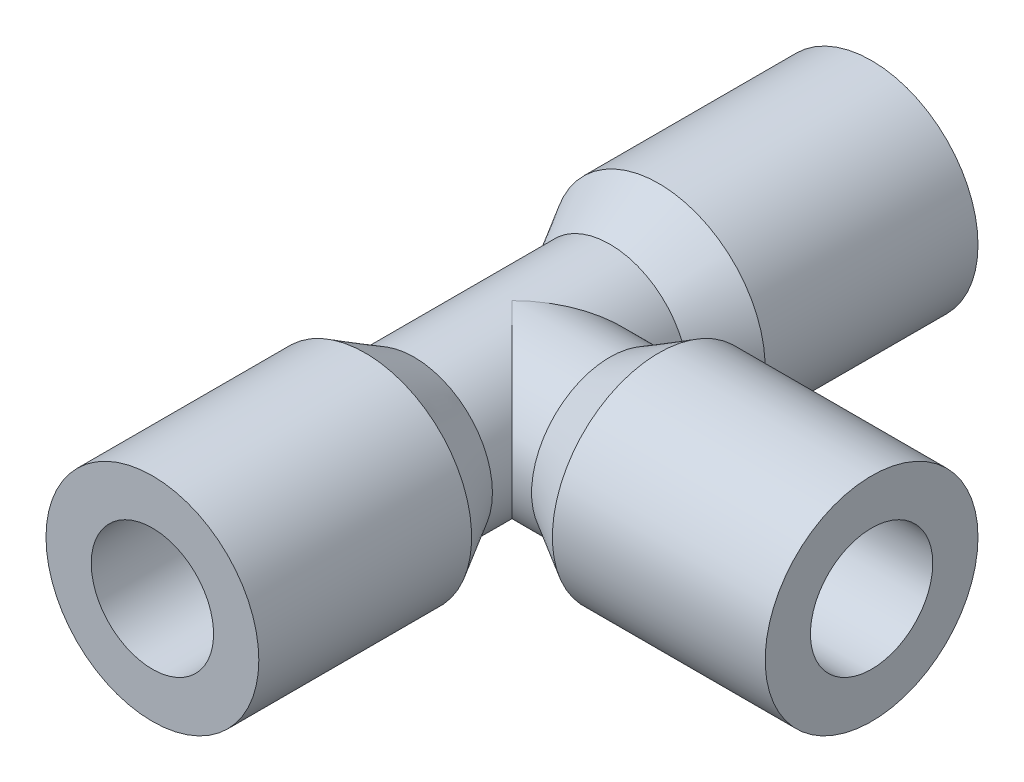
ISO-10303-21;
HEADER;
FILE_DESCRIPTION(('STEP AP214'),'2;1');
FILE_NAME('part.step','',(''),(''),'','','');
FILE_SCHEMA(('AUTOMOTIVE_DESIGN { 1 0 10303 214 1 1 1 1 }'));
ENDSEC;
DATA;
#1=APPLICATION_CONTEXT('core data for automotive mechanical design processes');
#2=APPLICATION_PROTOCOL_DEFINITION('international standard','automotive_design',2000,#1);
#3=PRODUCT_CONTEXT('',#1,'mechanical');
#4=PRODUCT('Part','Part','',(#3));
#5=PRODUCT_RELATED_PRODUCT_CATEGORY('part','',(#4));
#6=PRODUCT_DEFINITION_FORMATION('','',#4);
#7=PRODUCT_DEFINITION_CONTEXT('part definition',#1,'design');
#8=PRODUCT_DEFINITION('design','',#6,#7);
#9=PRODUCT_DEFINITION_SHAPE('','',#8);
#10=(LENGTH_UNIT() NAMED_UNIT(*) SI_UNIT(.MILLI.,.METRE.));
#11=(NAMED_UNIT(*) PLANE_ANGLE_UNIT() SI_UNIT($,.RADIAN.));
#12=(NAMED_UNIT(*) SI_UNIT($,.STERADIAN.) SOLID_ANGLE_UNIT());
#13=UNCERTAINTY_MEASURE_WITH_UNIT(LENGTH_MEASURE(1.E-05),#10,'distance_accuracy_value','');
#14=(GEOMETRIC_REPRESENTATION_CONTEXT(3) GLOBAL_UNCERTAINTY_ASSIGNED_CONTEXT((#13)) GLOBAL_UNIT_ASSIGNED_CONTEXT((#10,
#11,#12)) REPRESENTATION_CONTEXT('',''));
#15=CARTESIAN_POINT('',(0.,0.,0.));
#16=DIRECTION('',(0.,0.,1.));
#17=DIRECTION('',(1.,0.,0.));
#18=AXIS2_PLACEMENT_3D('',#15,#16,#17);
#19=CARTESIAN_POINT('',(1.77799999999999,0.,18.669));
#20=DIRECTION('',(1.,0.,0.));
#21=DIRECTION('',(0.,0.,-1.));
#22=AXIS2_PLACEMENT_3D('',#19,#20,#21);
#23=PLANE('',#22);
#24=DIRECTION('',(0.,0.,-1.));
#25=VECTOR('',#24,1.);
#26=CARTESIAN_POINT('',(1.77799999999999,-2.63046402750542,49.403));
#27=LINE('',#26,#25);
#28=CARTESIAN_POINT('',(1.77799999999999,-2.63046402750542,20.447));
#29=VERTEX_POINT('',#28);
#30=CARTESIAN_POINT('',(1.77799999999999,-2.63046402750542,16.891));
#31=VERTEX_POINT('',#30);
#32=EDGE_CURVE('E12',#29,#31,#27,.T.);
#33=ORIENTED_EDGE('',*,*,#32,.F.);
#34=CARTESIAN_POINT('',(1.77799999999999,0.,18.669));
#35=DIRECTION('',(1.,0.,0.));
#36=DIRECTION('',(0.,0.,-1.));
#37=AXIS2_PLACEMENT_3D('',#34,#35,#36);
#38=CIRCLE('',#37,3.175);
#39=EDGE_CURVE('E86',#29,#31,#38,.T.);
#40=ORIENTED_EDGE('',*,*,#39,.T.);
#41=EDGE_LOOP('',(#33,#40));
#42=FACE_BOUND('',#41,.T.);
#43=ADVANCED_FACE('F40',(#42),#23,.T.);
#44=CARTESIAN_POINT('',(0.,0.,18.669));
#45=DIRECTION('',(0.,0.,-1.));
#46=DIRECTION('',(-1.,0.,0.));
#47=AXIS2_PLACEMENT_3D('',#44,#45,#46);
#48=CYLINDRICAL_SURFACE('',#47,4.064);
#49=CARTESIAN_POINT('',(0.,0.,23.749));
#50=DIRECTION('',(0.,0.,1.));
#51=DIRECTION('',(1.,0.,0.));
#52=AXIS2_PLACEMENT_3D('',#49,#50,#51);
#53=CIRCLE('',#52,4.064);
#54=CARTESIAN_POINT('',(4.064,0.,23.749));
#55=VERTEX_POINT('',#54);
#56=EDGE_CURVE('E150',#55,#55,#53,.T.);
#57=ORIENTED_EDGE('',*,*,#56,.F.);
#58=EDGE_LOOP('',(#57));
#59=FACE_BOUND('',#58,.T.);
#60=CARTESIAN_POINT('',(0.,0.,13.589));
#61=DIRECTION('',(0.,0.,1.));
#62=DIRECTION('',(1.,0.,0.));
#63=AXIS2_PLACEMENT_3D('',#60,#61,#62);
#64=CIRCLE('',#63,4.064);
#65=CARTESIAN_POINT('',(4.064,0.,13.589));
#66=VERTEX_POINT('',#65);
#67=EDGE_CURVE('E159',#66,#66,#64,.T.);
#68=ORIENTED_EDGE('',*,*,#67,.T.);
#69=EDGE_LOOP('',(#68));
#70=FACE_BOUND('',#69,.T.);
#71=CARTESIAN_POINT('',(0.,0.,18.669));
#72=DIRECTION('',(-0.707106781186547,0.,-0.707106781186547));
#73=DIRECTION('',(0.707106781186547,0.,-0.707106781186547));
#74=AXIS2_PLACEMENT_3D('',#71,#72,#73);
#75=ELLIPSE('',#74,5.74736391748426,4.064);
#76=CARTESIAN_POINT('',(0.,-4.064,18.669));
#77=VERTEX_POINT('',#76);
#78=CARTESIAN_POINT('',(0.,4.064,18.669));
#79=VERTEX_POINT('',#78);
#80=EDGE_CURVE('E79',#77,#79,#75,.F.);
#81=ORIENTED_EDGE('',*,*,#80,.F.);
#82=CARTESIAN_POINT('',(0.,0.,18.669));
#83=DIRECTION('',(0.707106781186547,0.,-0.707106781186547));
#84=DIRECTION('',(-0.707106781186547,0.,-0.707106781186547));
#85=AXIS2_PLACEMENT_3D('',#82,#83,#84);
#86=ELLIPSE('',#85,5.74736391748426,4.064);
#87=EDGE_CURVE('E61',#79,#77,#86,.T.);
#88=ORIENTED_EDGE('',*,*,#87,.F.);
#89=EDGE_LOOP('',(#81,#88));
#90=FACE_BOUND('',#89,.T.);
#91=ADVANCED_FACE('F178',(#59,#70,#90),#48,.T.);
#92=CARTESIAN_POINT('',(0.,0.,11.049));
#93=DIRECTION('',(0.,0.,-1.));
#94=DIRECTION('',(-1.,0.,0.));
#95=AXIS2_PLACEMENT_3D('',#92,#93,#94);
#96=CYLINDRICAL_SURFACE('',#95,5.5245);
#97=CARTESIAN_POINT('',(0.,0.,11.049));
#98=DIRECTION('',(0.,0.,-1.));
#99=DIRECTION('',(-1.,0.,0.));
#100=AXIS2_PLACEMENT_3D('',#97,#98,#99);
#101=CIRCLE('',#100,5.5245);
#102=CARTESIAN_POINT('',(-5.5245,0.,11.049));
#103=VERTEX_POINT('',#102);
#104=EDGE_CURVE('E233',#103,#103,#101,.F.);
#105=ORIENTED_EDGE('',*,*,#104,.F.);
#106=EDGE_LOOP('',(#105));
#107=FACE_BOUND('',#106,.T.);
#108=CARTESIAN_POINT('',(0.,0.,0.));
#109=DIRECTION('',(0.,0.,1.));
#110=DIRECTION('',(1.,0.,0.));
#111=AXIS2_PLACEMENT_3D('',#108,#109,#110);
#112=CIRCLE('',#111,5.5245);
#113=CARTESIAN_POINT('',(5.5245,0.,0.));
#114=VERTEX_POINT('',#113);
#115=EDGE_CURVE('E245',#114,#114,#112,.T.);
#116=ORIENTED_EDGE('',*,*,#115,.T.);
#117=EDGE_LOOP('',(#116));
#118=FACE_BOUND('',#117,.T.);
#119=ADVANCED_FACE('F42',(#107,#118),#96,.T.);
#120=CARTESIAN_POINT('',(0.,0.,0.));
#121=DIRECTION('',(0.,0.,1.));
#122=DIRECTION('',(1.,0.,0.));
#123=AXIS2_PLACEMENT_3D('',#120,#121,#122);
#124=PLANE('',#123);
#125=CARTESIAN_POINT('',(0.,0.,0.));
#126=DIRECTION('',(0.,0.,-1.));
#127=DIRECTION('',(-1.,0.,0.));
#128=AXIS2_PLACEMENT_3D('',#125,#126,#127);
#129=CIRCLE('',#128,3.175);
#130=CARTESIAN_POINT('',(-3.175,0.,0.));
#131=VERTEX_POINT('',#130);
#132=EDGE_CURVE('E362',#131,#131,#129,.T.);
#133=ORIENTED_EDGE('',*,*,#132,.F.);
#134=EDGE_LOOP('',(#133));
#135=FACE_BOUND('',#134,.T.);
#136=ORIENTED_EDGE('',*,*,#115,.F.);
#137=EDGE_LOOP('',(#136));
#138=FACE_BOUND('',#137,.T.);
#139=ADVANCED_FACE('F176',(#135,#138),#124,.F.);
#140=CARTESIAN_POINT('',(0.,0.,13.589));
#141=DIRECTION('',(0.,0.,-1.));
#142=DIRECTION('',(-1.,0.,0.));
#143=AXIS2_PLACEMENT_3D('',#140,#141,#142);
#144=CONICAL_SURFACE('',#143,4.064,0.52183427981441);
#145=ORIENTED_EDGE('',*,*,#104,.T.);
#146=EDGE_LOOP('',(#145));
#147=FACE_BOUND('',#146,.T.);
#148=ORIENTED_EDGE('',*,*,#67,.F.);
#149=EDGE_LOOP('',(#148));
#150=FACE_BOUND('',#149,.T.);
#151=ADVANCED_FACE('F166',(#147,#150),#144,.T.);
#152=CARTESIAN_POINT('',(0.,0.,26.289));
#153=DIRECTION('',(0.,0.,1.));
#154=DIRECTION('',(-1.,0.,0.));
#155=AXIS2_PLACEMENT_3D('',#152,#153,#154);
#156=CYLINDRICAL_SURFACE('',#155,5.5245);
#157=CARTESIAN_POINT('',(0.,0.,26.289));
#158=DIRECTION('',(0.,0.,-1.));
#159=DIRECTION('',(-1.,0.,0.));
#160=AXIS2_PLACEMENT_3D('',#157,#158,#159);
#161=CIRCLE('',#160,5.5245);
#162=CARTESIAN_POINT('',(-5.5245,0.,26.289));
#163=VERTEX_POINT('',#162);
#164=EDGE_CURVE('E246',#163,#163,#161,.F.);
#165=ORIENTED_EDGE('',*,*,#164,.T.);
#166=EDGE_LOOP('',(#165));
#167=FACE_BOUND('',#166,.T.);
#168=CARTESIAN_POINT('',(0.,0.,37.338));
#169=DIRECTION('',(0.,0.,1.));
#170=DIRECTION('',(1.,0.,0.));
#171=AXIS2_PLACEMENT_3D('',#168,#169,#170);
#172=CIRCLE('',#171,5.5245);
#173=CARTESIAN_POINT('',(5.5245,0.,37.338));
#174=VERTEX_POINT('',#173);
#175=EDGE_CURVE('E147',#174,#174,#172,.T.);
#176=ORIENTED_EDGE('',*,*,#175,.F.);
#177=EDGE_LOOP('',(#176));
#178=FACE_BOUND('',#177,.T.);
#179=ADVANCED_FACE('F175',(#167,#178),#156,.T.);
#180=CARTESIAN_POINT('',(0.,0.,37.338));
#181=DIRECTION('',(0.,0.,-1.));
#182=DIRECTION('',(1.,0.,0.));
#183=AXIS2_PLACEMENT_3D('',#180,#181,#182);
#184=PLANE('',#183);
#185=CARTESIAN_POINT('',(0.,0.,37.338));
#186=DIRECTION('',(0.,0.,-1.));
#187=DIRECTION('',(-1.,0.,0.));
#188=AXIS2_PLACEMENT_3D('',#185,#186,#187);
#189=CIRCLE('',#188,3.175);
#190=CARTESIAN_POINT('',(-3.175,0.,37.338));
#191=VERTEX_POINT('',#190);
#192=EDGE_CURVE('E87',#191,#191,#189,.T.);
#193=ORIENTED_EDGE('',*,*,#192,.T.);
#194=EDGE_LOOP('',(#193));
#195=FACE_BOUND('',#194,.T.);
#196=ORIENTED_EDGE('',*,*,#175,.T.);
#197=EDGE_LOOP('',(#196));
#198=FACE_BOUND('',#197,.T.);
#199=ADVANCED_FACE('F132',(#195,#198),#184,.F.);
#200=CARTESIAN_POINT('',(0.,0.,23.749));
#201=DIRECTION('',(0.,0.,1.));
#202=DIRECTION('',(-1.,0.,0.));
#203=AXIS2_PLACEMENT_3D('',#200,#201,#202);
#204=CONICAL_SURFACE('',#203,4.064,0.52183427981441);
#205=ORIENTED_EDGE('',*,*,#164,.F.);
#206=EDGE_LOOP('',(#205));
#207=FACE_BOUND('',#206,.T.);
#208=ORIENTED_EDGE('',*,*,#56,.T.);
#209=EDGE_LOOP('',(#208));
#210=FACE_BOUND('',#209,.T.);
#211=ADVANCED_FACE('F127',(#207,#210),#204,.T.);
#212=CARTESIAN_POINT('',(5.08,0.,18.669));
#213=DIRECTION('',(-1.,0.,0.));
#214=DIRECTION('',(0.,0.,1.));
#215=AXIS2_PLACEMENT_3D('',#212,#213,#214);
#216=CYLINDRICAL_SURFACE('',#215,4.064);
#217=CARTESIAN_POINT('',(5.08,0.,18.669));
#218=DIRECTION('',(1.,0.,0.));
#219=DIRECTION('',(0.,0.,-1.));
#220=AXIS2_PLACEMENT_3D('',#217,#218,#219);
#221=CIRCLE('',#220,4.064);
#222=CARTESIAN_POINT('',(5.08,0.,14.605));
#223=VERTEX_POINT('',#222);
#224=EDGE_CURVE('E153',#223,#223,#221,.T.);
#225=ORIENTED_EDGE('',*,*,#224,.F.);
#226=EDGE_LOOP('',(#225));
#227=FACE_BOUND('',#226,.T.);
#228=ORIENTED_EDGE('',*,*,#87,.T.);
#229=ORIENTED_EDGE('',*,*,#80,.T.);
#230=EDGE_LOOP('',(#228,#229));
#231=FACE_BOUND('',#230,.T.);
#232=ADVANCED_FACE('F121',(#227,#231),#216,.T.);
#233=CARTESIAN_POINT('',(5.08,0.,18.669));
#234=DIRECTION('',(1.,0.,0.));
#235=DIRECTION('',(0.,0.,-1.));
#236=AXIS2_PLACEMENT_3D('',#233,#234,#235);
#237=CONICAL_SURFACE('',#236,4.064,0.521834279814411);
#238=ORIENTED_EDGE('',*,*,#224,.T.);
#239=EDGE_LOOP('',(#238));
#240=FACE_BOUND('',#239,.T.);
#241=CARTESIAN_POINT('',(7.62,0.,18.669));
#242=DIRECTION('',(1.,0.,0.));
#243=DIRECTION('',(0.,0.,-1.));
#244=AXIS2_PLACEMENT_3D('',#241,#242,#243);
#245=CIRCLE('',#244,5.5245);
#246=CARTESIAN_POINT('',(7.62,0.,13.1445));
#247=VERTEX_POINT('',#246);
#248=EDGE_CURVE('E93',#247,#247,#245,.T.);
#249=ORIENTED_EDGE('',*,*,#248,.F.);
#250=EDGE_LOOP('',(#249));
#251=FACE_BOUND('',#250,.T.);
#252=ADVANCED_FACE('F110',(#240,#251),#237,.T.);
#253=CARTESIAN_POINT('',(18.669,0.,18.669));
#254=DIRECTION('',(-1.,0.,0.));
#255=DIRECTION('',(0.,0.,1.));
#256=AXIS2_PLACEMENT_3D('',#253,#254,#255);
#257=CYLINDRICAL_SURFACE('',#256,5.5245);
#258=CARTESIAN_POINT('',(18.669,0.,18.669));
#259=DIRECTION('',(1.,0.,0.));
#260=DIRECTION('',(0.,0.,-1.));
#261=AXIS2_PLACEMENT_3D('',#258,#259,#260);
#262=CIRCLE('',#261,5.5245);
#263=CARTESIAN_POINT('',(18.669,0.,13.1445));
#264=VERTEX_POINT('',#263);
#265=EDGE_CURVE('E90',#264,#264,#262,.T.);
#266=ORIENTED_EDGE('',*,*,#265,.F.);
#267=EDGE_LOOP('',(#266));
#268=FACE_BOUND('',#267,.T.);
#269=ORIENTED_EDGE('',*,*,#248,.T.);
#270=EDGE_LOOP('',(#269));
#271=FACE_BOUND('',#270,.T.);
#272=ADVANCED_FACE('F120',(#268,#271),#257,.T.);
#273=CARTESIAN_POINT('',(18.669,0.,18.669));
#274=DIRECTION('',(1.,0.,0.));
#275=DIRECTION('',(0.,0.,-1.));
#276=AXIS2_PLACEMENT_3D('',#273,#274,#275);
#277=PLANE('',#276);
#278=CARTESIAN_POINT('',(18.669,0.,18.669));
#279=DIRECTION('',(1.,0.,0.));
#280=DIRECTION('',(0.,0.,-1.));
#281=AXIS2_PLACEMENT_3D('',#278,#279,#280);
#282=CIRCLE('',#281,3.175);
#283=CARTESIAN_POINT('',(18.669,0.,15.494));
#284=VERTEX_POINT('',#283);
#285=EDGE_CURVE('E95',#284,#284,#282,.T.);
#286=ORIENTED_EDGE('',*,*,#285,.F.);
#287=EDGE_LOOP('',(#286));
#288=FACE_BOUND('',#287,.T.);
#289=ORIENTED_EDGE('',*,*,#265,.T.);
#290=EDGE_LOOP('',(#289));
#291=FACE_BOUND('',#290,.T.);
#292=ADVANCED_FACE('F203',(#288,#291),#277,.T.);
#293=CARTESIAN_POINT('',(1.77799999999999,0.,18.669));
#294=DIRECTION('',(1.,0.,0.));
#295=DIRECTION('',(0.,0.,-1.));
#296=AXIS2_PLACEMENT_3D('',#293,#294,#295);
#297=CYLINDRICAL_SURFACE('',#296,3.175);
#298=ORIENTED_EDGE('',*,*,#39,.F.);
#299=CARTESIAN_POINT('',(0.,0.,18.669));
#300=DIRECTION('',(0.707106781186547,0.,-0.707106781186547));
#301=DIRECTION('',(0.707106781186547,0.,0.707106781186547));
#302=AXIS2_PLACEMENT_3D('',#299,#300,#301);
#303=ELLIPSE('',#302,4.49012806053458,3.175);
#304=CARTESIAN_POINT('',(1.77799999999999,2.63046402750542,20.447));
#305=VERTEX_POINT('',#304);
#306=EDGE_CURVE('E74',#29,#305,#303,.F.);
#307=ORIENTED_EDGE('',*,*,#306,.T.);
#308=CARTESIAN_POINT('',(1.77799999999999,2.63046402750542,16.891));
#309=VERTEX_POINT('',#308);
#310=EDGE_CURVE('E84',#309,#305,#38,.T.);
#311=ORIENTED_EDGE('',*,*,#310,.F.);
#312=CARTESIAN_POINT('',(0.,0.,18.669));
#313=DIRECTION('',(0.707106781186547,0.,0.707106781186547));
#314=DIRECTION('',(0.707106781186547,0.,-0.707106781186547));
#315=AXIS2_PLACEMENT_3D('',#312,#313,#314);
#316=ELLIPSE('',#315,4.49012806053458,3.175);
#317=EDGE_CURVE('E54',#309,#31,#316,.F.);
#318=ORIENTED_EDGE('',*,*,#317,.T.);
#319=EDGE_LOOP('',(#298,#307,#311,#318));
#320=FACE_BOUND('',#319,.T.);
#321=ORIENTED_EDGE('',*,*,#285,.T.);
#322=EDGE_LOOP('',(#321));
#323=FACE_BOUND('',#322,.T.);
#324=ADVANCED_FACE('F82',(#320,#323),#297,.F.);
#325=DIRECTION('',(0.,0.,-1.));
#326=VECTOR('',#325,1.);
#327=CARTESIAN_POINT('',(1.77799999999999,2.63046402750542,49.403));
#328=LINE('',#327,#326);
#329=EDGE_CURVE('E48',#309,#305,#328,.F.);
#330=ORIENTED_EDGE('',*,*,#329,.F.);
#331=ORIENTED_EDGE('',*,*,#310,.T.);
#332=EDGE_LOOP('',(#330,#331));
#333=FACE_BOUND('',#332,.T.);
#334=ADVANCED_FACE('F89',(#333),#23,.T.);
#335=CARTESIAN_POINT('',(0.,0.,49.403));
#336=DIRECTION('',(0.,0.,-1.));
#337=DIRECTION('',(-1.,0.,0.));
#338=AXIS2_PLACEMENT_3D('',#335,#336,#337);
#339=CYLINDRICAL_SURFACE('',#338,3.175);
#340=ORIENTED_EDGE('',*,*,#132,.T.);
#341=EDGE_LOOP('',(#340));
#342=FACE_BOUND('',#341,.T.);
#343=ORIENTED_EDGE('',*,*,#32,.T.);
#344=ORIENTED_EDGE('',*,*,#317,.F.);
#345=ORIENTED_EDGE('',*,*,#329,.T.);
#346=ORIENTED_EDGE('',*,*,#306,.F.);
#347=EDGE_LOOP('',(#343,#344,#345,#346));
#348=FACE_BOUND('',#347,.T.);
#349=ORIENTED_EDGE('',*,*,#192,.F.);
#350=EDGE_LOOP('',(#349));
#351=FACE_BOUND('',#350,.T.);
#352=ADVANCED_FACE('F72',(#342,#348,#351),#339,.F.);
#353=CLOSED_SHELL('',(#43,#91,#119,#139,#151,#179,#199,#211,#232,#252,#272,#292,#324,#334,#352));
#354=MANIFOLD_SOLID_BREP('B2',#353);
#355=ADVANCED_BREP_SHAPE_REPRESENTATION('',(#18,#354),#14);
#356=SHAPE_DEFINITION_REPRESENTATION(#9,#355);
ENDSEC;
END-ISO-10303-21;
